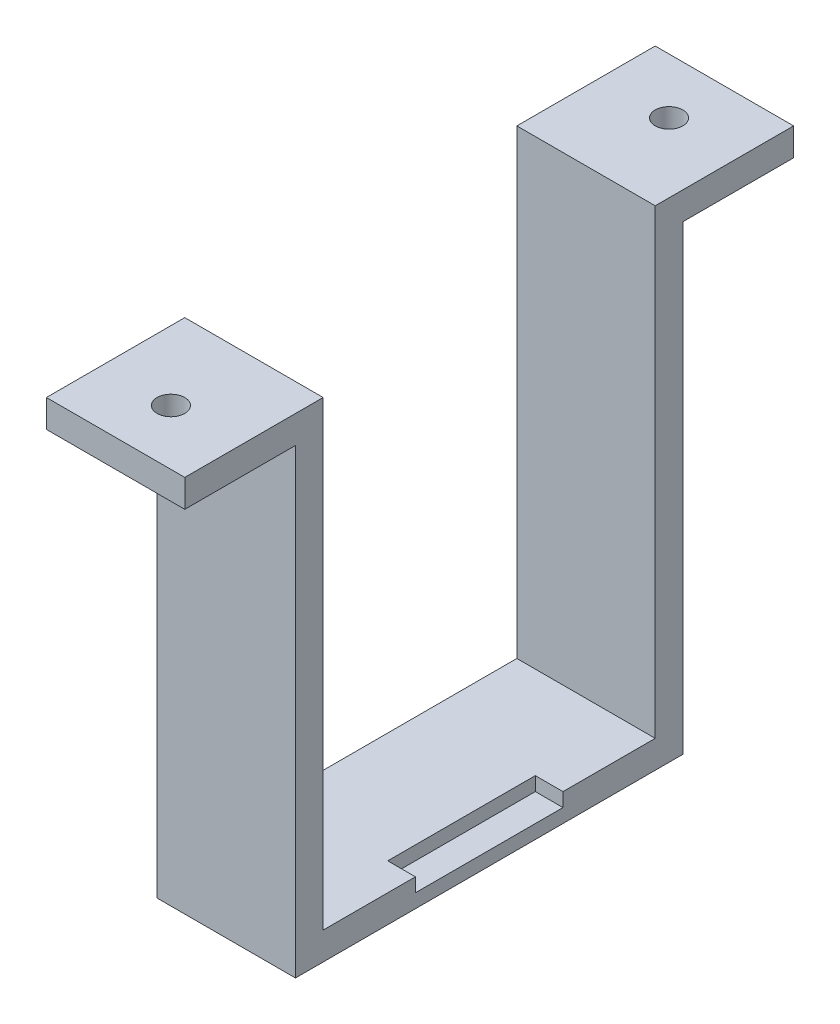
ISO-10303-21;
HEADER;
FILE_DESCRIPTION(('STEP AP214'),'2;1');
FILE_NAME('part.step','',(''),(''),'','','');
FILE_SCHEMA(('AUTOMOTIVE_DESIGN { 1 0 10303 214 1 1 1 1 }'));
ENDSEC;
DATA;
#1=APPLICATION_CONTEXT('core data for automotive mechanical design processes');
#2=APPLICATION_PROTOCOL_DEFINITION('international standard','automotive_design',2000,#1);
#3=PRODUCT_CONTEXT('',#1,'mechanical');
#4=PRODUCT('Part','Part','',(#3));
#5=PRODUCT_RELATED_PRODUCT_CATEGORY('part','',(#4));
#6=PRODUCT_DEFINITION_FORMATION('','',#4);
#7=PRODUCT_DEFINITION_CONTEXT('part definition',#1,'design');
#8=PRODUCT_DEFINITION('design','',#6,#7);
#9=PRODUCT_DEFINITION_SHAPE('','',#8);
#10=(LENGTH_UNIT() NAMED_UNIT(*) SI_UNIT(.MILLI.,.METRE.));
#11=(NAMED_UNIT(*) PLANE_ANGLE_UNIT() SI_UNIT($,.RADIAN.));
#12=(NAMED_UNIT(*) SI_UNIT($,.STERADIAN.) SOLID_ANGLE_UNIT());
#13=UNCERTAINTY_MEASURE_WITH_UNIT(LENGTH_MEASURE(1.E-05),#10,'distance_accuracy_value','');
#14=(GEOMETRIC_REPRESENTATION_CONTEXT(3) GLOBAL_UNCERTAINTY_ASSIGNED_CONTEXT((#13)) GLOBAL_UNIT_ASSIGNED_CONTEXT((#10,
#11,#12)) REPRESENTATION_CONTEXT('',''));
#15=CARTESIAN_POINT('',(0.,0.,0.));
#16=DIRECTION('',(0.,0.,1.));
#17=DIRECTION('',(1.,0.,0.));
#18=AXIS2_PLACEMENT_3D('',#15,#16,#17);
#19=CARTESIAN_POINT('',(15.,0.,-18.));
#20=DIRECTION('',(0.,0.,-1.));
#21=DIRECTION('',(-1.,0.,0.));
#22=AXIS2_PLACEMENT_3D('',#19,#20,#21);
#23=PLANE('',#22);
#24=DIRECTION('',(0.,-1.,0.));
#25=VECTOR('',#24,1.);
#26=CARTESIAN_POINT('',(0.,0.,-18.));
#27=LINE('',#26,#25);
#28=CARTESIAN_POINT('',(0.,50.,-18.));
#29=VERTEX_POINT('',#28);
#30=CARTESIAN_POINT('',(0.,0.,-18.));
#31=VERTEX_POINT('',#30);
#32=EDGE_CURVE('E169',#29,#31,#27,.T.);
#33=ORIENTED_EDGE('',*,*,#32,.T.);
#34=DIRECTION('',(-1.,0.,0.));
#35=VECTOR('',#34,1.);
#36=CARTESIAN_POINT('',(15.,0.,-18.));
#37=LINE('',#36,#35);
#38=CARTESIAN_POINT('',(15.,0.,-18.));
#39=VERTEX_POINT('',#38);
#40=EDGE_CURVE('E11',#39,#31,#37,.T.);
#41=ORIENTED_EDGE('',*,*,#40,.F.);
#42=DIRECTION('',(0.,-1.,0.));
#43=VECTOR('',#42,1.);
#44=CARTESIAN_POINT('',(15.,0.,-18.));
#45=LINE('',#44,#43);
#46=CARTESIAN_POINT('',(15.,50.,-18.));
#47=VERTEX_POINT('',#46);
#48=EDGE_CURVE('E194',#47,#39,#45,.T.);
#49=ORIENTED_EDGE('',*,*,#48,.F.);
#50=DIRECTION('',(-1.,0.,0.));
#51=VECTOR('',#50,1.);
#52=CARTESIAN_POINT('',(15.,50.,-18.));
#53=LINE('',#52,#51);
#54=EDGE_CURVE('E165',#47,#29,#53,.T.);
#55=ORIENTED_EDGE('',*,*,#54,.T.);
#56=EDGE_LOOP('',(#33,#41,#49,#55));
#57=FACE_BOUND('',#56,.T.);
#58=ADVANCED_FACE('F35',(#57),#23,.F.);
#59=CARTESIAN_POINT('',(15.,0.,0.));
#60=DIRECTION('',(0.,-1.,0.));
#61=DIRECTION('',(0.,0.,-1.));
#62=AXIS2_PLACEMENT_3D('',#59,#60,#61);
#63=PLANE('',#62);
#64=DIRECTION('',(0.,0.,1.));
#65=VECTOR('',#64,1.);
#66=CARTESIAN_POINT('',(15.,0.,0.));
#67=LINE('',#66,#65);
#68=CARTESIAN_POINT('',(15.,0.,8.));
#69=VERTEX_POINT('',#68);
#70=CARTESIAN_POINT('',(15.,0.,18.));
#71=VERTEX_POINT('',#70);
#72=EDGE_CURVE('E263',#69,#71,#67,.T.);
#73=ORIENTED_EDGE('',*,*,#72,.F.);
#74=DIRECTION('',(1.,0.,0.));
#75=VECTOR('',#74,1.);
#76=CARTESIAN_POINT('',(12.,0.,8.));
#77=LINE('',#76,#75);
#78=CARTESIAN_POINT('',(12.,0.,8.));
#79=VERTEX_POINT('',#78);
#80=EDGE_CURVE('E272',#79,#69,#77,.T.);
#81=ORIENTED_EDGE('',*,*,#80,.F.);
#82=DIRECTION('',(0.,0.,1.));
#83=VECTOR('',#82,1.);
#84=CARTESIAN_POINT('',(12.,0.,8.));
#85=LINE('',#84,#83);
#86=CARTESIAN_POINT('',(12.,0.,-8.00000000000001));
#87=VERTEX_POINT('',#86);
#88=EDGE_CURVE('E309',#87,#79,#85,.T.);
#89=ORIENTED_EDGE('',*,*,#88,.F.);
#90=DIRECTION('',(1.,0.,0.));
#91=VECTOR('',#90,1.);
#92=CARTESIAN_POINT('',(12.,0.,-8.00000000000001));
#93=LINE('',#92,#91);
#94=CARTESIAN_POINT('',(15.,0.,-8.00000000000001));
#95=VERTEX_POINT('',#94);
#96=EDGE_CURVE('E301',#87,#95,#93,.T.);
#97=ORIENTED_EDGE('',*,*,#96,.T.);
#98=EDGE_CURVE('E111',#39,#95,#67,.T.);
#99=ORIENTED_EDGE('',*,*,#98,.F.);
#100=ORIENTED_EDGE('',*,*,#40,.T.);
#101=DIRECTION('',(0.,0.,1.));
#102=VECTOR('',#101,1.);
#103=CARTESIAN_POINT('',(0.,0.,0.));
#104=LINE('',#103,#102);
#105=CARTESIAN_POINT('',(0.,0.,18.));
#106=VERTEX_POINT('',#105);
#107=EDGE_CURVE('E172',#31,#106,#104,.T.);
#108=ORIENTED_EDGE('',*,*,#107,.T.);
#109=DIRECTION('',(-1.,0.,0.));
#110=VECTOR('',#109,1.);
#111=CARTESIAN_POINT('',(15.,0.,18.));
#112=LINE('',#111,#110);
#113=EDGE_CURVE('E42',#71,#106,#112,.T.);
#114=ORIENTED_EDGE('',*,*,#113,.F.);
#115=EDGE_LOOP('',(#73,#81,#89,#97,#99,#100,#108,#114));
#116=FACE_BOUND('',#115,.T.);
#117=ADVANCED_FACE('F270',(#116),#63,.F.);
#118=CARTESIAN_POINT('',(15.,0.,18.));
#119=DIRECTION('',(0.,0.,1.));
#120=DIRECTION('',(1.,0.,0.));
#121=AXIS2_PLACEMENT_3D('',#118,#119,#120);
#122=PLANE('',#121);
#123=DIRECTION('',(0.,1.,0.));
#124=VECTOR('',#123,1.);
#125=CARTESIAN_POINT('',(0.,0.,18.));
#126=LINE('',#125,#124);
#127=CARTESIAN_POINT('',(0.,50.,18.));
#128=VERTEX_POINT('',#127);
#129=EDGE_CURVE('E175',#106,#128,#126,.T.);
#130=ORIENTED_EDGE('',*,*,#129,.T.);
#131=DIRECTION('',(-1.,0.,0.));
#132=VECTOR('',#131,1.);
#133=CARTESIAN_POINT('',(15.,50.,18.));
#134=LINE('',#133,#132);
#135=CARTESIAN_POINT('',(15.,50.,18.));
#136=VERTEX_POINT('',#135);
#137=EDGE_CURVE('E213',#136,#128,#134,.T.);
#138=ORIENTED_EDGE('',*,*,#137,.F.);
#139=DIRECTION('',(0.,1.,0.));
#140=VECTOR('',#139,1.);
#141=CARTESIAN_POINT('',(15.,0.,18.));
#142=LINE('',#141,#140);
#143=EDGE_CURVE('E222',#71,#136,#142,.T.);
#144=ORIENTED_EDGE('',*,*,#143,.F.);
#145=ORIENTED_EDGE('',*,*,#113,.T.);
#146=EDGE_LOOP('',(#130,#138,#144,#145));
#147=FACE_BOUND('',#146,.T.);
#148=ADVANCED_FACE('F220',(#147),#122,.F.);
#149=CARTESIAN_POINT('',(15.,50.,18.));
#150=DIRECTION('',(0.,-1.,0.));
#151=DIRECTION('',(0.,0.,-1.));
#152=AXIS2_PLACEMENT_3D('',#149,#150,#151);
#153=PLANE('',#152);
#154=CARTESIAN_POINT('',(7.5,50.,27.));
#155=DIRECTION('',(0.,-1.,0.));
#156=DIRECTION('',(0.,0.,-1.));
#157=AXIS2_PLACEMENT_3D('',#154,#155,#156);
#158=CIRCLE('',#157,1.5);
#159=CARTESIAN_POINT('',(7.5,50.,25.5));
#160=VERTEX_POINT('',#159);
#161=EDGE_CURVE('E267',#160,#160,#158,.F.);
#162=ORIENTED_EDGE('',*,*,#161,.F.);
#163=EDGE_LOOP('',(#162));
#164=FACE_BOUND('',#163,.T.);
#165=DIRECTION('',(0.,0.,1.));
#166=VECTOR('',#165,1.);
#167=CARTESIAN_POINT('',(0.,50.,18.));
#168=LINE('',#167,#166);
#169=CARTESIAN_POINT('',(0.,50.,33.));
#170=VERTEX_POINT('',#169);
#171=EDGE_CURVE('E177',#128,#170,#168,.T.);
#172=ORIENTED_EDGE('',*,*,#171,.T.);
#173=DIRECTION('',(-1.,0.,0.));
#174=VECTOR('',#173,1.);
#175=CARTESIAN_POINT('',(15.,50.,33.));
#176=LINE('',#175,#174);
#177=CARTESIAN_POINT('',(15.,50.,33.));
#178=VERTEX_POINT('',#177);
#179=EDGE_CURVE('E210',#178,#170,#176,.T.);
#180=ORIENTED_EDGE('',*,*,#179,.F.);
#181=DIRECTION('',(0.,0.,1.));
#182=VECTOR('',#181,1.);
#183=CARTESIAN_POINT('',(15.,50.,18.));
#184=LINE('',#183,#182);
#185=EDGE_CURVE('E241',#136,#178,#184,.T.);
#186=ORIENTED_EDGE('',*,*,#185,.F.);
#187=ORIENTED_EDGE('',*,*,#137,.T.);
#188=EDGE_LOOP('',(#172,#180,#186,#187));
#189=FACE_BOUND('',#188,.T.);
#190=ADVANCED_FACE('F232',(#164,#189),#153,.F.);
#191=CARTESIAN_POINT('',(15.,50.,33.));
#192=DIRECTION('',(0.,0.,-1.));
#193=DIRECTION('',(-1.,0.,0.));
#194=AXIS2_PLACEMENT_3D('',#191,#192,#193);
#195=PLANE('',#194);
#196=DIRECTION('',(0.,-1.,0.));
#197=VECTOR('',#196,1.);
#198=CARTESIAN_POINT('',(0.,50.,33.));
#199=LINE('',#198,#197);
#200=CARTESIAN_POINT('',(0.,47.,33.));
#201=VERTEX_POINT('',#200);
#202=EDGE_CURVE('E179',#170,#201,#199,.T.);
#203=ORIENTED_EDGE('',*,*,#202,.T.);
#204=DIRECTION('',(-1.,0.,0.));
#205=VECTOR('',#204,1.);
#206=CARTESIAN_POINT('',(15.,47.,33.));
#207=LINE('',#206,#205);
#208=CARTESIAN_POINT('',(15.,47.,33.));
#209=VERTEX_POINT('',#208);
#210=EDGE_CURVE('E207',#209,#201,#207,.T.);
#211=ORIENTED_EDGE('',*,*,#210,.F.);
#212=DIRECTION('',(0.,-1.,0.));
#213=VECTOR('',#212,1.);
#214=CARTESIAN_POINT('',(15.,50.,33.));
#215=LINE('',#214,#213);
#216=EDGE_CURVE('E238',#178,#209,#215,.T.);
#217=ORIENTED_EDGE('',*,*,#216,.F.);
#218=ORIENTED_EDGE('',*,*,#179,.T.);
#219=EDGE_LOOP('',(#203,#211,#217,#218));
#220=FACE_BOUND('',#219,.T.);
#221=ADVANCED_FACE('F236',(#220),#195,.F.);
#222=CARTESIAN_POINT('',(15.,47.,21.));
#223=DIRECTION('',(0.,1.,0.));
#224=DIRECTION('',(0.,0.,1.));
#225=AXIS2_PLACEMENT_3D('',#222,#223,#224);
#226=PLANE('',#225);
#227=CARTESIAN_POINT('',(7.5,47.,27.));
#228=DIRECTION('',(0.,-1.,0.));
#229=DIRECTION('',(0.,0.,-1.));
#230=AXIS2_PLACEMENT_3D('',#227,#228,#229);
#231=CIRCLE('',#230,1.5);
#232=CARTESIAN_POINT('',(7.5,47.,25.5));
#233=VERTEX_POINT('',#232);
#234=EDGE_CURVE('E321',#233,#233,#231,.T.);
#235=ORIENTED_EDGE('',*,*,#234,.F.);
#236=EDGE_LOOP('',(#235));
#237=FACE_BOUND('',#236,.T.);
#238=DIRECTION('',(0.,0.,-1.));
#239=VECTOR('',#238,1.);
#240=CARTESIAN_POINT('',(0.,47.,21.));
#241=LINE('',#240,#239);
#242=CARTESIAN_POINT('',(0.,47.,21.));
#243=VERTEX_POINT('',#242);
#244=EDGE_CURVE('E181',#201,#243,#241,.T.);
#245=ORIENTED_EDGE('',*,*,#244,.T.);
#246=DIRECTION('',(-1.,0.,0.));
#247=VECTOR('',#246,1.);
#248=CARTESIAN_POINT('',(15.,47.,21.));
#249=LINE('',#248,#247);
#250=CARTESIAN_POINT('',(15.,47.,21.));
#251=VERTEX_POINT('',#250);
#252=EDGE_CURVE('E204',#251,#243,#249,.T.);
#253=ORIENTED_EDGE('',*,*,#252,.F.);
#254=DIRECTION('',(0.,0.,-1.));
#255=VECTOR('',#254,1.);
#256=CARTESIAN_POINT('',(15.,47.,21.));
#257=LINE('',#256,#255);
#258=EDGE_CURVE('E240',#209,#251,#257,.T.);
#259=ORIENTED_EDGE('',*,*,#258,.F.);
#260=ORIENTED_EDGE('',*,*,#210,.T.);
#261=EDGE_LOOP('',(#245,#253,#259,#260));
#262=FACE_BOUND('',#261,.T.);
#263=ADVANCED_FACE('F342',(#237,#262),#226,.F.);
#264=CARTESIAN_POINT('',(15.,-3.,21.));
#265=DIRECTION('',(0.,0.,-1.));
#266=DIRECTION('',(-1.,0.,0.));
#267=AXIS2_PLACEMENT_3D('',#264,#265,#266);
#268=PLANE('',#267);
#269=DIRECTION('',(0.,-1.,0.));
#270=VECTOR('',#269,1.);
#271=CARTESIAN_POINT('',(0.,-3.,21.));
#272=LINE('',#271,#270);
#273=CARTESIAN_POINT('',(0.,-3.,21.));
#274=VERTEX_POINT('',#273);
#275=EDGE_CURVE('E183',#243,#274,#272,.T.);
#276=ORIENTED_EDGE('',*,*,#275,.T.);
#277=DIRECTION('',(-1.,0.,0.));
#278=VECTOR('',#277,1.);
#279=CARTESIAN_POINT('',(15.,-3.,21.));
#280=LINE('',#279,#278);
#281=CARTESIAN_POINT('',(15.,-3.,21.));
#282=VERTEX_POINT('',#281);
#283=EDGE_CURVE('E201',#282,#274,#280,.T.);
#284=ORIENTED_EDGE('',*,*,#283,.F.);
#285=DIRECTION('',(0.,-1.,0.));
#286=VECTOR('',#285,1.);
#287=CARTESIAN_POINT('',(15.,-3.,21.));
#288=LINE('',#287,#286);
#289=EDGE_CURVE('E243',#251,#282,#288,.T.);
#290=ORIENTED_EDGE('',*,*,#289,.F.);
#291=ORIENTED_EDGE('',*,*,#252,.T.);
#292=EDGE_LOOP('',(#276,#284,#290,#291));
#293=FACE_BOUND('',#292,.T.);
#294=ADVANCED_FACE('F373',(#293),#268,.F.);
#295=CARTESIAN_POINT('',(15.,-3.,0.));
#296=DIRECTION('',(0.,1.,0.));
#297=DIRECTION('',(0.,0.,1.));
#298=AXIS2_PLACEMENT_3D('',#295,#296,#297);
#299=PLANE('',#298);
#300=DIRECTION('',(0.,0.,-1.));
#301=VECTOR('',#300,1.);
#302=CARTESIAN_POINT('',(0.,-3.,0.));
#303=LINE('',#302,#301);
#304=CARTESIAN_POINT('',(0.,-3.,-21.));
#305=VERTEX_POINT('',#304);
#306=EDGE_CURVE('E186',#274,#305,#303,.T.);
#307=ORIENTED_EDGE('',*,*,#306,.T.);
#308=DIRECTION('',(-1.,0.,0.));
#309=VECTOR('',#308,1.);
#310=CARTESIAN_POINT('',(15.,-3.,-21.));
#311=LINE('',#310,#309);
#312=CARTESIAN_POINT('',(15.,-3.,-21.));
#313=VERTEX_POINT('',#312);
#314=EDGE_CURVE('E198',#313,#305,#311,.T.);
#315=ORIENTED_EDGE('',*,*,#314,.F.);
#316=DIRECTION('',(0.,0.,-1.));
#317=VECTOR('',#316,1.);
#318=CARTESIAN_POINT('',(15.,-3.,0.));
#319=LINE('',#318,#317);
#320=EDGE_CURVE('E249',#282,#313,#319,.T.);
#321=ORIENTED_EDGE('',*,*,#320,.F.);
#322=ORIENTED_EDGE('',*,*,#283,.T.);
#323=EDGE_LOOP('',(#307,#315,#321,#322));
#324=FACE_BOUND('',#323,.T.);
#325=ADVANCED_FACE('F255',(#324),#299,.F.);
#326=CARTESIAN_POINT('',(15.,-3.,-21.));
#327=DIRECTION('',(0.,0.,1.));
#328=DIRECTION('',(1.,0.,0.));
#329=AXIS2_PLACEMENT_3D('',#326,#327,#328);
#330=PLANE('',#329);
#331=DIRECTION('',(0.,1.,0.));
#332=VECTOR('',#331,1.);
#333=CARTESIAN_POINT('',(0.,-3.,-21.));
#334=LINE('',#333,#332);
#335=CARTESIAN_POINT('',(0.,47.,-21.));
#336=VERTEX_POINT('',#335);
#337=EDGE_CURVE('E188',#305,#336,#334,.T.);
#338=ORIENTED_EDGE('',*,*,#337,.T.);
#339=DIRECTION('',(-1.,0.,0.));
#340=VECTOR('',#339,1.);
#341=CARTESIAN_POINT('',(15.,47.,-21.));
#342=LINE('',#341,#340);
#343=CARTESIAN_POINT('',(15.,47.,-21.));
#344=VERTEX_POINT('',#343);
#345=EDGE_CURVE('E160',#344,#336,#342,.T.);
#346=ORIENTED_EDGE('',*,*,#345,.F.);
#347=DIRECTION('',(0.,1.,0.));
#348=VECTOR('',#347,1.);
#349=CARTESIAN_POINT('',(15.,-3.,-21.));
#350=LINE('',#349,#348);
#351=EDGE_CURVE('E148',#313,#344,#350,.T.);
#352=ORIENTED_EDGE('',*,*,#351,.F.);
#353=ORIENTED_EDGE('',*,*,#314,.T.);
#354=EDGE_LOOP('',(#338,#346,#352,#353));
#355=FACE_BOUND('',#354,.T.);
#356=ADVANCED_FACE('F258',(#355),#330,.F.);
#357=CARTESIAN_POINT('',(15.,47.,-21.));
#358=DIRECTION('',(0.,1.,0.));
#359=DIRECTION('',(0.,0.,1.));
#360=AXIS2_PLACEMENT_3D('',#357,#358,#359);
#361=PLANE('',#360);
#362=CARTESIAN_POINT('',(7.5,47.,-27.));
#363=DIRECTION('',(0.,-1.,0.));
#364=DIRECTION('',(0.,0.,-1.));
#365=AXIS2_PLACEMENT_3D('',#362,#363,#364);
#366=CIRCLE('',#365,1.5);
#367=CARTESIAN_POINT('',(7.5,47.,-28.5));
#368=VERTEX_POINT('',#367);
#369=EDGE_CURVE('E324',#368,#368,#366,.T.);
#370=ORIENTED_EDGE('',*,*,#369,.F.);
#371=EDGE_LOOP('',(#370));
#372=FACE_BOUND('',#371,.T.);
#373=DIRECTION('',(0.,0.,-1.));
#374=VECTOR('',#373,1.);
#375=CARTESIAN_POINT('',(0.,47.,-21.));
#376=LINE('',#375,#374);
#377=CARTESIAN_POINT('',(0.,47.,-33.));
#378=VERTEX_POINT('',#377);
#379=EDGE_CURVE('E157',#336,#378,#376,.T.);
#380=ORIENTED_EDGE('',*,*,#379,.T.);
#381=DIRECTION('',(-1.,0.,0.));
#382=VECTOR('',#381,1.);
#383=CARTESIAN_POINT('',(15.,47.,-33.));
#384=LINE('',#383,#382);
#385=CARTESIAN_POINT('',(15.,47.,-33.));
#386=VERTEX_POINT('',#385);
#387=EDGE_CURVE('E154',#386,#378,#384,.T.);
#388=ORIENTED_EDGE('',*,*,#387,.F.);
#389=DIRECTION('',(0.,0.,-1.));
#390=VECTOR('',#389,1.);
#391=CARTESIAN_POINT('',(15.,47.,-21.));
#392=LINE('',#391,#390);
#393=EDGE_CURVE('E140',#344,#386,#392,.T.);
#394=ORIENTED_EDGE('',*,*,#393,.F.);
#395=ORIENTED_EDGE('',*,*,#345,.T.);
#396=EDGE_LOOP('',(#380,#388,#394,#395));
#397=FACE_BOUND('',#396,.T.);
#398=ADVANCED_FACE('F155',(#372,#397),#361,.F.);
#399=CARTESIAN_POINT('',(15.,50.,-33.));
#400=DIRECTION('',(0.,0.,1.));
#401=DIRECTION('',(1.,0.,0.));
#402=AXIS2_PLACEMENT_3D('',#399,#400,#401);
#403=PLANE('',#402);
#404=DIRECTION('',(0.,1.,0.));
#405=VECTOR('',#404,1.);
#406=CARTESIAN_POINT('',(0.,50.,-33.));
#407=LINE('',#406,#405);
#408=CARTESIAN_POINT('',(0.,50.,-33.));
#409=VERTEX_POINT('',#408);
#410=EDGE_CURVE('E191',#378,#409,#407,.T.);
#411=ORIENTED_EDGE('',*,*,#410,.T.);
#412=DIRECTION('',(-1.,0.,0.));
#413=VECTOR('',#412,1.);
#414=CARTESIAN_POINT('',(15.,50.,-33.));
#415=LINE('',#414,#413);
#416=CARTESIAN_POINT('',(15.,50.,-33.));
#417=VERTEX_POINT('',#416);
#418=EDGE_CURVE('E161',#417,#409,#415,.T.);
#419=ORIENTED_EDGE('',*,*,#418,.F.);
#420=DIRECTION('',(0.,1.,0.));
#421=VECTOR('',#420,1.);
#422=CARTESIAN_POINT('',(15.,50.,-33.));
#423=LINE('',#422,#421);
#424=EDGE_CURVE('E145',#386,#417,#423,.T.);
#425=ORIENTED_EDGE('',*,*,#424,.F.);
#426=ORIENTED_EDGE('',*,*,#387,.T.);
#427=EDGE_LOOP('',(#411,#419,#425,#426));
#428=FACE_BOUND('',#427,.T.);
#429=ADVANCED_FACE('F163',(#428),#403,.F.);
#430=CARTESIAN_POINT('',(15.,50.,-18.));
#431=DIRECTION('',(0.,-1.,0.));
#432=DIRECTION('',(0.,0.,-1.));
#433=AXIS2_PLACEMENT_3D('',#430,#431,#432);
#434=PLANE('',#433);
#435=CARTESIAN_POINT('',(7.5,50.,-27.));
#436=DIRECTION('',(0.,-1.,0.));
#437=DIRECTION('',(0.,0.,-1.));
#438=AXIS2_PLACEMENT_3D('',#435,#436,#437);
#439=CIRCLE('',#438,1.5);
#440=CARTESIAN_POINT('',(7.5,50.,-28.5));
#441=VERTEX_POINT('',#440);
#442=EDGE_CURVE('E173',#441,#441,#439,.F.);
#443=ORIENTED_EDGE('',*,*,#442,.F.);
#444=EDGE_LOOP('',(#443));
#445=FACE_BOUND('',#444,.T.);
#446=DIRECTION('',(0.,0.,1.));
#447=VECTOR('',#446,1.);
#448=CARTESIAN_POINT('',(0.,50.,-18.));
#449=LINE('',#448,#447);
#450=EDGE_CURVE('E103',#409,#29,#449,.T.);
#451=ORIENTED_EDGE('',*,*,#450,.T.);
#452=ORIENTED_EDGE('',*,*,#54,.F.);
#453=DIRECTION('',(0.,0.,1.));
#454=VECTOR('',#453,1.);
#455=CARTESIAN_POINT('',(15.,50.,-18.));
#456=LINE('',#455,#454);
#457=EDGE_CURVE('E58',#417,#47,#456,.T.);
#458=ORIENTED_EDGE('',*,*,#457,.F.);
#459=ORIENTED_EDGE('',*,*,#418,.T.);
#460=EDGE_LOOP('',(#451,#452,#458,#459));
#461=FACE_BOUND('',#460,.T.);
#462=ADVANCED_FACE('F259',(#445,#461),#434,.F.);
#463=CARTESIAN_POINT('',(15.,0.,0.));
#464=DIRECTION('',(-1.,0.,0.));
#465=DIRECTION('',(0.,0.,1.));
#466=AXIS2_PLACEMENT_3D('',#463,#464,#465);
#467=PLANE('',#466);
#468=DIRECTION('',(0.,0.,-1.));
#469=VECTOR('',#468,1.);
#470=CARTESIAN_POINT('',(15.,-1.50000000000004,8.));
#471=LINE('',#470,#469);
#472=CARTESIAN_POINT('',(15.,-1.50000000000004,8.));
#473=VERTEX_POINT('',#472);
#474=CARTESIAN_POINT('',(15.,-1.50000000000004,-8.00000000000001));
#475=VERTEX_POINT('',#474);
#476=EDGE_CURVE('E300',#473,#475,#471,.T.);
#477=ORIENTED_EDGE('',*,*,#476,.F.);
#478=DIRECTION('',(0.,-1.,0.));
#479=VECTOR('',#478,1.);
#480=CARTESIAN_POINT('',(15.,0.,8.));
#481=LINE('',#480,#479);
#482=EDGE_CURVE('E49',#69,#473,#481,.T.);
#483=ORIENTED_EDGE('',*,*,#482,.F.);
#484=ORIENTED_EDGE('',*,*,#72,.T.);
#485=ORIENTED_EDGE('',*,*,#143,.T.);
#486=ORIENTED_EDGE('',*,*,#185,.T.);
#487=ORIENTED_EDGE('',*,*,#216,.T.);
#488=ORIENTED_EDGE('',*,*,#258,.T.);
#489=ORIENTED_EDGE('',*,*,#289,.T.);
#490=ORIENTED_EDGE('',*,*,#320,.T.);
#491=ORIENTED_EDGE('',*,*,#351,.T.);
#492=ORIENTED_EDGE('',*,*,#393,.T.);
#493=ORIENTED_EDGE('',*,*,#424,.T.);
#494=ORIENTED_EDGE('',*,*,#457,.T.);
#495=ORIENTED_EDGE('',*,*,#48,.T.);
#496=ORIENTED_EDGE('',*,*,#98,.T.);
#497=DIRECTION('',(0.,1.,0.));
#498=VECTOR('',#497,1.);
#499=CARTESIAN_POINT('',(15.,0.,-8.00000000000001));
#500=LINE('',#499,#498);
#501=EDGE_CURVE('E284',#475,#95,#500,.T.);
#502=ORIENTED_EDGE('',*,*,#501,.F.);
#503=EDGE_LOOP('',(#477,#483,#484,#485,#486,#487,#488,#489,#490,#491,#492,#493,#494,#495,#496,#502));
#504=FACE_BOUND('',#503,.T.);
#505=ADVANCED_FACE('F143',(#504),#467,.F.);
#506=CARTESIAN_POINT('',(0.,0.,0.));
#507=DIRECTION('',(-1.,0.,0.));
#508=DIRECTION('',(0.,0.,1.));
#509=AXIS2_PLACEMENT_3D('',#506,#507,#508);
#510=PLANE('',#509);
#511=ORIENTED_EDGE('',*,*,#32,.F.);
#512=ORIENTED_EDGE('',*,*,#450,.F.);
#513=ORIENTED_EDGE('',*,*,#410,.F.);
#514=ORIENTED_EDGE('',*,*,#379,.F.);
#515=ORIENTED_EDGE('',*,*,#337,.F.);
#516=ORIENTED_EDGE('',*,*,#306,.F.);
#517=ORIENTED_EDGE('',*,*,#275,.F.);
#518=ORIENTED_EDGE('',*,*,#244,.F.);
#519=ORIENTED_EDGE('',*,*,#202,.F.);
#520=ORIENTED_EDGE('',*,*,#171,.F.);
#521=ORIENTED_EDGE('',*,*,#129,.F.);
#522=ORIENTED_EDGE('',*,*,#107,.F.);
#523=EDGE_LOOP('',(#511,#512,#513,#514,#515,#516,#517,#518,#519,#520,#521,#522));
#524=FACE_BOUND('',#523,.T.);
#525=ADVANCED_FACE('F227',(#524),#510,.T.);
#526=CARTESIAN_POINT('',(7.5,50.001,-27.));
#527=DIRECTION('',(0.,-1.,0.));
#528=DIRECTION('',(0.,0.,-1.));
#529=AXIS2_PLACEMENT_3D('',#526,#527,#528);
#530=CYLINDRICAL_SURFACE('',#529,1.5);
#531=ORIENTED_EDGE('',*,*,#369,.T.);
#532=EDGE_LOOP('',(#531));
#533=FACE_BOUND('',#532,.T.);
#534=ORIENTED_EDGE('',*,*,#442,.T.);
#535=EDGE_LOOP('',(#534));
#536=FACE_BOUND('',#535,.T.);
#537=ADVANCED_FACE('F415',(#533,#536),#530,.F.);
#538=CARTESIAN_POINT('',(7.5,50.001,27.));
#539=DIRECTION('',(0.,-1.,0.));
#540=DIRECTION('',(0.,0.,-1.));
#541=AXIS2_PLACEMENT_3D('',#538,#539,#540);
#542=CYLINDRICAL_SURFACE('',#541,1.5);
#543=ORIENTED_EDGE('',*,*,#234,.T.);
#544=EDGE_LOOP('',(#543));
#545=FACE_BOUND('',#544,.T.);
#546=ORIENTED_EDGE('',*,*,#161,.T.);
#547=EDGE_LOOP('',(#546));
#548=FACE_BOUND('',#547,.T.);
#549=ADVANCED_FACE('F334',(#545,#548),#542,.F.);
#550=CARTESIAN_POINT('',(12.,0.,8.));
#551=DIRECTION('',(0.,0.,1.));
#552=DIRECTION('',(1.,0.,0.));
#553=AXIS2_PLACEMENT_3D('',#550,#551,#552);
#554=PLANE('',#553);
#555=ORIENTED_EDGE('',*,*,#482,.T.);
#556=DIRECTION('',(1.,0.,0.));
#557=VECTOR('',#556,1.);
#558=CARTESIAN_POINT('',(12.,-1.50000000000004,8.));
#559=LINE('',#558,#557);
#560=CARTESIAN_POINT('',(12.,-1.50000000000004,8.));
#561=VERTEX_POINT('',#560);
#562=EDGE_CURVE('E302',#561,#473,#559,.T.);
#563=ORIENTED_EDGE('',*,*,#562,.F.);
#564=DIRECTION('',(0.,-1.,0.));
#565=VECTOR('',#564,1.);
#566=CARTESIAN_POINT('',(12.,0.,8.));
#567=LINE('',#566,#565);
#568=EDGE_CURVE('E312',#79,#561,#567,.T.);
#569=ORIENTED_EDGE('',*,*,#568,.F.);
#570=ORIENTED_EDGE('',*,*,#80,.T.);
#571=EDGE_LOOP('',(#555,#563,#569,#570));
#572=FACE_BOUND('',#571,.T.);
#573=ADVANCED_FACE('F458',(#572),#554,.F.);
#574=CARTESIAN_POINT('',(12.,0.,-8.00000000000001));
#575=DIRECTION('',(0.,0.,-1.));
#576=DIRECTION('',(-1.,0.,0.));
#577=AXIS2_PLACEMENT_3D('',#574,#575,#576);
#578=PLANE('',#577);
#579=ORIENTED_EDGE('',*,*,#501,.T.);
#580=ORIENTED_EDGE('',*,*,#96,.F.);
#581=DIRECTION('',(0.,1.,0.));
#582=VECTOR('',#581,1.);
#583=CARTESIAN_POINT('',(12.,0.,-8.00000000000001));
#584=LINE('',#583,#582);
#585=CARTESIAN_POINT('',(12.,-1.50000000000004,-8.00000000000001));
#586=VERTEX_POINT('',#585);
#587=EDGE_CURVE('E305',#586,#87,#584,.T.);
#588=ORIENTED_EDGE('',*,*,#587,.F.);
#589=DIRECTION('',(1.,0.,0.));
#590=VECTOR('',#589,1.);
#591=CARTESIAN_POINT('',(12.,-1.50000000000004,-8.00000000000001));
#592=LINE('',#591,#590);
#593=EDGE_CURVE('E294',#586,#475,#592,.T.);
#594=ORIENTED_EDGE('',*,*,#593,.T.);
#595=EDGE_LOOP('',(#579,#580,#588,#594));
#596=FACE_BOUND('',#595,.T.);
#597=ADVANCED_FACE('F306',(#596),#578,.F.);
#598=CARTESIAN_POINT('',(12.,-1.50000000000004,8.));
#599=DIRECTION('',(0.,-1.,0.));
#600=DIRECTION('',(0.,0.,-1.));
#601=AXIS2_PLACEMENT_3D('',#598,#599,#600);
#602=PLANE('',#601);
#603=ORIENTED_EDGE('',*,*,#476,.T.);
#604=ORIENTED_EDGE('',*,*,#593,.F.);
#605=DIRECTION('',(0.,0.,-1.));
#606=VECTOR('',#605,1.);
#607=CARTESIAN_POINT('',(12.,-1.50000000000004,8.));
#608=LINE('',#607,#606);
#609=EDGE_CURVE('E298',#561,#586,#608,.T.);
#610=ORIENTED_EDGE('',*,*,#609,.F.);
#611=ORIENTED_EDGE('',*,*,#562,.T.);
#612=EDGE_LOOP('',(#603,#604,#610,#611));
#613=FACE_BOUND('',#612,.T.);
#614=ADVANCED_FACE('F296',(#613),#602,.F.);
#615=CARTESIAN_POINT('',(12.,0.,0.));
#616=DIRECTION('',(1.,0.,0.));
#617=DIRECTION('',(0.,0.,-1.));
#618=AXIS2_PLACEMENT_3D('',#615,#616,#617);
#619=PLANE('',#618);
#620=ORIENTED_EDGE('',*,*,#568,.T.);
#621=ORIENTED_EDGE('',*,*,#609,.T.);
#622=ORIENTED_EDGE('',*,*,#587,.T.);
#623=ORIENTED_EDGE('',*,*,#88,.T.);
#624=EDGE_LOOP('',(#620,#621,#622,#623));
#625=FACE_BOUND('',#624,.T.);
#626=ADVANCED_FACE('F311',(#625),#619,.T.);
#627=CLOSED_SHELL('',(#58,#117,#148,#190,#221,#263,#294,#325,#356,#398,#429,#462,#505,#525,#537,
#549,#573,#597,#614,#626));
#628=MANIFOLD_SOLID_BREP('B2',#627);
#629=ADVANCED_BREP_SHAPE_REPRESENTATION('',(#18,#628),#14);
#630=SHAPE_DEFINITION_REPRESENTATION(#9,#629);
ENDSEC;
END-ISO-10303-21;
